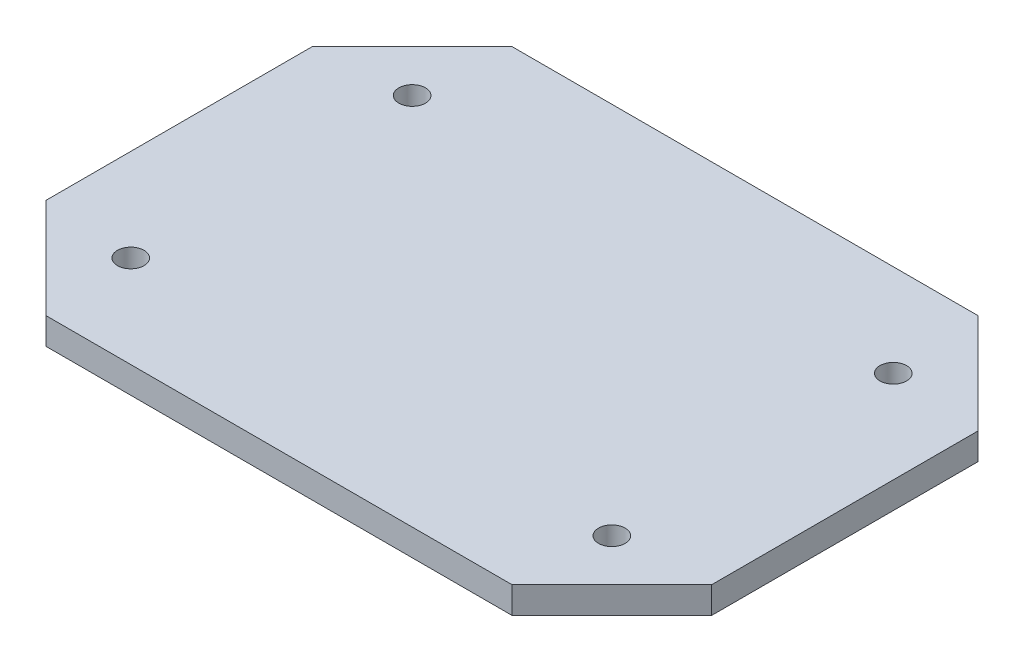
ISO-10303-21;
HEADER;
FILE_DESCRIPTION(('STEP AP214'),'2;1');
FILE_NAME('part.step','',(''),(''),'','','');
FILE_SCHEMA(('AUTOMOTIVE_DESIGN { 1 0 10303 214 1 1 1 1 }'));
ENDSEC;
DATA;
#1=APPLICATION_CONTEXT('core data for automotive mechanical design processes');
#2=APPLICATION_PROTOCOL_DEFINITION('international standard','automotive_design',2000,#1);
#3=PRODUCT_CONTEXT('',#1,'mechanical');
#4=PRODUCT('Part','Part','',(#3));
#5=PRODUCT_RELATED_PRODUCT_CATEGORY('part','',(#4));
#6=PRODUCT_DEFINITION_FORMATION('','',#4);
#7=PRODUCT_DEFINITION_CONTEXT('part definition',#1,'design');
#8=PRODUCT_DEFINITION('design','',#6,#7);
#9=PRODUCT_DEFINITION_SHAPE('','',#8);
#10=(LENGTH_UNIT() NAMED_UNIT(*) SI_UNIT(.MILLI.,.METRE.));
#11=(NAMED_UNIT(*) PLANE_ANGLE_UNIT() SI_UNIT($,.RADIAN.));
#12=(NAMED_UNIT(*) SI_UNIT($,.STERADIAN.) SOLID_ANGLE_UNIT());
#13=UNCERTAINTY_MEASURE_WITH_UNIT(LENGTH_MEASURE(1.E-05),#10,'distance_accuracy_value','');
#14=(GEOMETRIC_REPRESENTATION_CONTEXT(3) GLOBAL_UNCERTAINTY_ASSIGNED_CONTEXT((#13)) GLOBAL_UNIT_ASSIGNED_CONTEXT((#10,
#11,#12)) REPRESENTATION_CONTEXT('',''));
#15=CARTESIAN_POINT('',(0.,0.,0.));
#16=DIRECTION('',(0.,0.,1.));
#17=DIRECTION('',(1.,0.,0.));
#18=AXIS2_PLACEMENT_3D('',#15,#16,#17);
#19=CARTESIAN_POINT('',(0.,5.08,0.));
#20=DIRECTION('',(0.,-1.,0.));
#21=DIRECTION('',(0.,0.,-1.));
#22=AXIS2_PLACEMENT_3D('',#19,#20,#21);
#23=PLANE('',#22);
#24=DIRECTION('',(-0.707106781186546,0.,0.707106781186549));
#25=VECTOR('',#24,1.);
#26=CARTESIAN_POINT('',(19.05,5.08,-88.9));
#27=LINE('',#26,#25);
#28=CARTESIAN_POINT('',(19.05,5.08,-88.9));
#29=VERTEX_POINT('',#28);
#30=CARTESIAN_POINT('',(0.,5.08,-69.8499999999999));
#31=VERTEX_POINT('',#30);
#32=EDGE_CURVE('E149',#29,#31,#27,.T.);
#33=ORIENTED_EDGE('',*,*,#32,.T.);
#34=DIRECTION('',(0.,0.,1.));
#35=VECTOR('',#34,1.);
#36=CARTESIAN_POINT('',(0.,5.08,-69.8499999999999));
#37=LINE('',#36,#35);
#38=CARTESIAN_POINT('',(0.,5.08,-19.05));
#39=VERTEX_POINT('',#38);
#40=EDGE_CURVE('E97',#31,#39,#37,.T.);
#41=ORIENTED_EDGE('',*,*,#40,.T.);
#42=DIRECTION('',(0.707106781186547,0.,0.707106781186548));
#43=VECTOR('',#42,1.);
#44=CARTESIAN_POINT('',(19.05,5.08,0.));
#45=LINE('',#44,#43);
#46=CARTESIAN_POINT('',(19.05,5.08,0.));
#47=VERTEX_POINT('',#46);
#48=EDGE_CURVE('E164',#39,#47,#45,.T.);
#49=ORIENTED_EDGE('',*,*,#48,.T.);
#50=DIRECTION('',(1.,0.,0.));
#51=VECTOR('',#50,1.);
#52=CARTESIAN_POINT('',(107.95,5.08,0.));
#53=LINE('',#52,#51);
#54=CARTESIAN_POINT('',(107.95,5.08,0.));
#55=VERTEX_POINT('',#54);
#56=EDGE_CURVE('E177',#47,#55,#53,.T.);
#57=ORIENTED_EDGE('',*,*,#56,.T.);
#58=DIRECTION('',(0.707106781186546,0.,-0.707106781186549));
#59=VECTOR('',#58,1.);
#60=CARTESIAN_POINT('',(107.95,5.08,0.));
#61=LINE('',#60,#59);
#62=CARTESIAN_POINT('',(127.,5.08,-19.0500000000001));
#63=VERTEX_POINT('',#62);
#64=EDGE_CURVE('E116',#55,#63,#61,.T.);
#65=ORIENTED_EDGE('',*,*,#64,.T.);
#66=DIRECTION('',(0.,0.,-1.));
#67=VECTOR('',#66,1.);
#68=CARTESIAN_POINT('',(127.,5.08,-69.8499999999999));
#69=LINE('',#68,#67);
#70=CARTESIAN_POINT('',(127.,5.08,-69.8499999999999));
#71=VERTEX_POINT('',#70);
#72=EDGE_CURVE('E110',#63,#71,#69,.T.);
#73=ORIENTED_EDGE('',*,*,#72,.T.);
#74=DIRECTION('',(-0.707106781186547,0.,-0.707106781186549));
#75=VECTOR('',#74,1.);
#76=CARTESIAN_POINT('',(107.95,5.08,-88.9));
#77=LINE('',#76,#75);
#78=CARTESIAN_POINT('',(107.95,5.08,-88.9));
#79=VERTEX_POINT('',#78);
#80=EDGE_CURVE('E114',#71,#79,#77,.T.);
#81=ORIENTED_EDGE('',*,*,#80,.T.);
#82=DIRECTION('',(-1.,0.,0.));
#83=VECTOR('',#82,1.);
#84=CARTESIAN_POINT('',(107.95,5.08,-88.9));
#85=LINE('',#84,#83);
#86=EDGE_CURVE('E54',#79,#29,#85,.T.);
#87=ORIENTED_EDGE('',*,*,#86,.T.);
#88=EDGE_LOOP('',(#33,#41,#49,#57,#65,#73,#81,#87));
#89=FACE_BOUND('',#88,.T.);
#90=CARTESIAN_POINT('',(17.6072305089622,5.08,-71.2927694910377));
#91=DIRECTION('',(0.,1.,0.));
#92=DIRECTION('',(0.,0.,1.));
#93=AXIS2_PLACEMENT_3D('',#90,#91,#92);
#94=CIRCLE('',#93,2.54);
#95=CARTESIAN_POINT('',(17.6072305089622,5.08,-68.7527694910377));
#96=VERTEX_POINT('',#95);
#97=EDGE_CURVE('E138',#96,#96,#94,.T.);
#98=ORIENTED_EDGE('',*,*,#97,.F.);
#99=EDGE_LOOP('',(#98));
#100=FACE_BOUND('',#99,.T.);
#101=CARTESIAN_POINT('',(17.6072305089622,5.08,-17.6072305089623));
#102=DIRECTION('',(0.,1.,0.));
#103=DIRECTION('',(0.,0.,-1.));
#104=AXIS2_PLACEMENT_3D('',#101,#102,#103);
#105=CIRCLE('',#104,2.54);
#106=CARTESIAN_POINT('',(17.6072305089622,5.08,-20.1472305089623));
#107=VERTEX_POINT('',#106);
#108=EDGE_CURVE('E186',#107,#107,#105,.T.);
#109=ORIENTED_EDGE('',*,*,#108,.F.);
#110=EDGE_LOOP('',(#109));
#111=FACE_BOUND('',#110,.T.);
#112=CARTESIAN_POINT('',(109.392769491038,5.08,-17.6072305089623));
#113=DIRECTION('',(0.,1.,0.));
#114=DIRECTION('',(0.,0.,1.));
#115=AXIS2_PLACEMENT_3D('',#112,#113,#114);
#116=CIRCLE('',#115,2.54);
#117=CARTESIAN_POINT('',(109.392769491038,5.08,-15.0672305089623));
#118=VERTEX_POINT('',#117);
#119=EDGE_CURVE('E192',#118,#118,#116,.T.);
#120=ORIENTED_EDGE('',*,*,#119,.F.);
#121=EDGE_LOOP('',(#120));
#122=FACE_BOUND('',#121,.T.);
#123=CARTESIAN_POINT('',(109.392769491038,5.08,-71.2927694910377));
#124=DIRECTION('',(0.,1.,0.));
#125=DIRECTION('',(0.,0.,-1.));
#126=AXIS2_PLACEMENT_3D('',#123,#124,#125);
#127=CIRCLE('',#126,2.53999999999999);
#128=CARTESIAN_POINT('',(109.392769491038,5.08,-73.8327694910377));
#129=VERTEX_POINT('',#128);
#130=EDGE_CURVE('E198',#129,#129,#127,.T.);
#131=ORIENTED_EDGE('',*,*,#130,.F.);
#132=EDGE_LOOP('',(#131));
#133=FACE_BOUND('',#132,.T.);
#134=ADVANCED_FACE('F37',(#89,#100,#111,#122,#133),#23,.F.);
#135=CARTESIAN_POINT('',(0.,0.,0.));
#136=DIRECTION('',(0.,-1.,0.));
#137=DIRECTION('',(0.,0.,-1.));
#138=AXIS2_PLACEMENT_3D('',#135,#136,#137);
#139=PLANE('',#138);
#140=CARTESIAN_POINT('',(109.392769491038,0.,-17.6072305089623));
#141=DIRECTION('',(0.,1.,0.));
#142=DIRECTION('',(0.,0.,1.));
#143=AXIS2_PLACEMENT_3D('',#140,#141,#142);
#144=CIRCLE('',#143,2.54);
#145=CARTESIAN_POINT('',(109.392769491038,0.,-15.0672305089623));
#146=VERTEX_POINT('',#145);
#147=EDGE_CURVE('E195',#146,#146,#144,.T.);
#148=ORIENTED_EDGE('',*,*,#147,.T.);
#149=EDGE_LOOP('',(#148));
#150=FACE_BOUND('',#149,.T.);
#151=CARTESIAN_POINT('',(17.6072305089622,0.,-71.2927694910377));
#152=DIRECTION('',(0.,1.,0.));
#153=DIRECTION('',(0.,0.,1.));
#154=AXIS2_PLACEMENT_3D('',#151,#152,#153);
#155=CIRCLE('',#154,2.54);
#156=CARTESIAN_POINT('',(17.6072305089622,0.,-68.7527694910377));
#157=VERTEX_POINT('',#156);
#158=EDGE_CURVE('E183',#157,#157,#155,.T.);
#159=ORIENTED_EDGE('',*,*,#158,.T.);
#160=EDGE_LOOP('',(#159));
#161=FACE_BOUND('',#160,.T.);
#162=DIRECTION('',(-0.707106781186546,0.,0.707106781186549));
#163=VECTOR('',#162,1.);
#164=CARTESIAN_POINT('',(19.05,0.,-88.9));
#165=LINE('',#164,#163);
#166=CARTESIAN_POINT('',(19.05,0.,-88.9));
#167=VERTEX_POINT('',#166);
#168=CARTESIAN_POINT('',(0.,0.,-69.8499999999999));
#169=VERTEX_POINT('',#168);
#170=EDGE_CURVE('E134',#167,#169,#165,.T.);
#171=ORIENTED_EDGE('',*,*,#170,.F.);
#172=DIRECTION('',(-1.,0.,0.));
#173=VECTOR('',#172,1.);
#174=CARTESIAN_POINT('',(107.95,0.,-88.9));
#175=LINE('',#174,#173);
#176=CARTESIAN_POINT('',(107.95,0.,-88.9));
#177=VERTEX_POINT('',#176);
#178=EDGE_CURVE('E89',#177,#167,#175,.T.);
#179=ORIENTED_EDGE('',*,*,#178,.F.);
#180=DIRECTION('',(-0.707106781186547,0.,-0.707106781186549));
#181=VECTOR('',#180,1.);
#182=CARTESIAN_POINT('',(107.95,0.,-88.9));
#183=LINE('',#182,#181);
#184=CARTESIAN_POINT('',(127.,0.,-69.8499999999999));
#185=VERTEX_POINT('',#184);
#186=EDGE_CURVE('E83',#185,#177,#183,.T.);
#187=ORIENTED_EDGE('',*,*,#186,.F.);
#188=DIRECTION('',(0.,0.,-1.));
#189=VECTOR('',#188,1.);
#190=CARTESIAN_POINT('',(127.,0.,-69.8499999999999));
#191=LINE('',#190,#189);
#192=CARTESIAN_POINT('',(127.,0.,-19.0500000000001));
#193=VERTEX_POINT('',#192);
#194=EDGE_CURVE('E124',#193,#185,#191,.T.);
#195=ORIENTED_EDGE('',*,*,#194,.F.);
#196=DIRECTION('',(0.707106781186546,0.,-0.707106781186549));
#197=VECTOR('',#196,1.);
#198=CARTESIAN_POINT('',(107.95,0.,0.));
#199=LINE('',#198,#197);
#200=CARTESIAN_POINT('',(107.95,0.,0.));
#201=VERTEX_POINT('',#200);
#202=EDGE_CURVE('E144',#201,#193,#199,.T.);
#203=ORIENTED_EDGE('',*,*,#202,.F.);
#204=DIRECTION('',(1.,0.,0.));
#205=VECTOR('',#204,1.);
#206=CARTESIAN_POINT('',(107.95,0.,0.));
#207=LINE('',#206,#205);
#208=CARTESIAN_POINT('',(19.05,0.,0.));
#209=VERTEX_POINT('',#208);
#210=EDGE_CURVE('E142',#209,#201,#207,.T.);
#211=ORIENTED_EDGE('',*,*,#210,.F.);
#212=DIRECTION('',(0.707106781186547,0.,0.707106781186548));
#213=VECTOR('',#212,1.);
#214=CARTESIAN_POINT('',(19.05,0.,0.));
#215=LINE('',#214,#213);
#216=CARTESIAN_POINT('',(0.,0.,-19.05));
#217=VERTEX_POINT('',#216);
#218=EDGE_CURVE('E140',#217,#209,#215,.T.);
#219=ORIENTED_EDGE('',*,*,#218,.F.);
#220=DIRECTION('',(0.,0.,1.));
#221=VECTOR('',#220,1.);
#222=CARTESIAN_POINT('',(0.,0.,-69.8499999999999));
#223=LINE('',#222,#221);
#224=EDGE_CURVE('E137',#169,#217,#223,.T.);
#225=ORIENTED_EDGE('',*,*,#224,.F.);
#226=EDGE_LOOP('',(#171,#179,#187,#195,#203,#211,#219,#225));
#227=FACE_BOUND('',#226,.T.);
#228=CARTESIAN_POINT('',(17.6072305089622,0.,-17.6072305089623));
#229=DIRECTION('',(0.,1.,0.));
#230=DIRECTION('',(0.,0.,-1.));
#231=AXIS2_PLACEMENT_3D('',#228,#229,#230);
#232=CIRCLE('',#231,2.54);
#233=CARTESIAN_POINT('',(17.6072305089622,0.,-20.1472305089623));
#234=VERTEX_POINT('',#233);
#235=EDGE_CURVE('E189',#234,#234,#232,.T.);
#236=ORIENTED_EDGE('',*,*,#235,.T.);
#237=EDGE_LOOP('',(#236));
#238=FACE_BOUND('',#237,.T.);
#239=CARTESIAN_POINT('',(109.392769491038,0.,-71.2927694910377));
#240=DIRECTION('',(0.,1.,0.));
#241=DIRECTION('',(0.,0.,-1.));
#242=AXIS2_PLACEMENT_3D('',#239,#240,#241);
#243=CIRCLE('',#242,2.53999999999999);
#244=CARTESIAN_POINT('',(109.392769491038,0.,-73.8327694910377));
#245=VERTEX_POINT('',#244);
#246=EDGE_CURVE('E201',#245,#245,#243,.T.);
#247=ORIENTED_EDGE('',*,*,#246,.T.);
#248=EDGE_LOOP('',(#247));
#249=FACE_BOUND('',#248,.T.);
#250=ADVANCED_FACE('F168',(#150,#161,#227,#238,#249),#139,.T.);
#251=CARTESIAN_POINT('',(19.05,5.08,-88.9));
#252=DIRECTION('',(0.707106781186549,0.,0.707106781186546));
#253=DIRECTION('',(0.707106781186546,0.,-0.707106781186549));
#254=AXIS2_PLACEMENT_3D('',#251,#252,#253);
#255=PLANE('',#254);
#256=ORIENTED_EDGE('',*,*,#170,.T.);
#257=DIRECTION('',(0.,-1.,0.));
#258=VECTOR('',#257,1.);
#259=CARTESIAN_POINT('',(0.,5.08,-69.8499999999999));
#260=LINE('',#259,#258);
#261=EDGE_CURVE('E11',#31,#169,#260,.T.);
#262=ORIENTED_EDGE('',*,*,#261,.F.);
#263=ORIENTED_EDGE('',*,*,#32,.F.);
#264=DIRECTION('',(0.,-1.,0.));
#265=VECTOR('',#264,1.);
#266=CARTESIAN_POINT('',(19.05,5.08,-88.9));
#267=LINE('',#266,#265);
#268=EDGE_CURVE('E130',#29,#167,#267,.T.);
#269=ORIENTED_EDGE('',*,*,#268,.T.);
#270=EDGE_LOOP('',(#256,#262,#263,#269));
#271=FACE_BOUND('',#270,.T.);
#272=ADVANCED_FACE('F39',(#271),#255,.F.);
#273=CARTESIAN_POINT('',(0.,5.08,-69.8499999999999));
#274=DIRECTION('',(1.,0.,0.));
#275=DIRECTION('',(0.,0.,-1.));
#276=AXIS2_PLACEMENT_3D('',#273,#274,#275);
#277=PLANE('',#276);
#278=ORIENTED_EDGE('',*,*,#224,.T.);
#279=DIRECTION('',(0.,-1.,0.));
#280=VECTOR('',#279,1.);
#281=CARTESIAN_POINT('',(0.,5.08,-19.05));
#282=LINE('',#281,#280);
#283=EDGE_CURVE('E46',#39,#217,#282,.T.);
#284=ORIENTED_EDGE('',*,*,#283,.F.);
#285=ORIENTED_EDGE('',*,*,#40,.F.);
#286=ORIENTED_EDGE('',*,*,#261,.T.);
#287=EDGE_LOOP('',(#278,#284,#285,#286));
#288=FACE_BOUND('',#287,.T.);
#289=ADVANCED_FACE('F233',(#288),#277,.F.);
#290=CARTESIAN_POINT('',(19.05,5.08,0.));
#291=DIRECTION('',(0.707106781186548,0.,-0.707106781186547));
#292=DIRECTION('',(-0.707106781186547,0.,-0.707106781186548));
#293=AXIS2_PLACEMENT_3D('',#290,#291,#292);
#294=PLANE('',#293);
#295=ORIENTED_EDGE('',*,*,#218,.T.);
#296=DIRECTION('',(0.,-1.,0.));
#297=VECTOR('',#296,1.);
#298=CARTESIAN_POINT('',(19.05,5.08,0.));
#299=LINE('',#298,#297);
#300=EDGE_CURVE('E156',#47,#209,#299,.T.);
#301=ORIENTED_EDGE('',*,*,#300,.F.);
#302=ORIENTED_EDGE('',*,*,#48,.F.);
#303=ORIENTED_EDGE('',*,*,#283,.T.);
#304=EDGE_LOOP('',(#295,#301,#302,#303));
#305=FACE_BOUND('',#304,.T.);
#306=ADVANCED_FACE('F162',(#305),#294,.F.);
#307=CARTESIAN_POINT('',(107.95,5.08,0.));
#308=DIRECTION('',(0.,0.,-1.));
#309=DIRECTION('',(-1.,0.,0.));
#310=AXIS2_PLACEMENT_3D('',#307,#308,#309);
#311=PLANE('',#310);
#312=ORIENTED_EDGE('',*,*,#210,.T.);
#313=DIRECTION('',(0.,-1.,0.));
#314=VECTOR('',#313,1.);
#315=CARTESIAN_POINT('',(107.95,5.08,0.));
#316=LINE('',#315,#314);
#317=EDGE_CURVE('E153',#55,#201,#316,.T.);
#318=ORIENTED_EDGE('',*,*,#317,.F.);
#319=ORIENTED_EDGE('',*,*,#56,.F.);
#320=ORIENTED_EDGE('',*,*,#300,.T.);
#321=EDGE_LOOP('',(#312,#318,#319,#320));
#322=FACE_BOUND('',#321,.T.);
#323=ADVANCED_FACE('F173',(#322),#311,.F.);
#324=CARTESIAN_POINT('',(107.95,5.08,0.));
#325=DIRECTION('',(-0.707106781186549,0.,-0.707106781186546));
#326=DIRECTION('',(-0.707106781186546,0.,0.707106781186549));
#327=AXIS2_PLACEMENT_3D('',#324,#325,#326);
#328=PLANE('',#327);
#329=ORIENTED_EDGE('',*,*,#202,.T.);
#330=DIRECTION('',(0.,-1.,0.));
#331=VECTOR('',#330,1.);
#332=CARTESIAN_POINT('',(127.,5.08,-19.0500000000001));
#333=LINE('',#332,#331);
#334=EDGE_CURVE('E125',#63,#193,#333,.T.);
#335=ORIENTED_EDGE('',*,*,#334,.F.);
#336=ORIENTED_EDGE('',*,*,#64,.F.);
#337=ORIENTED_EDGE('',*,*,#317,.T.);
#338=EDGE_LOOP('',(#329,#335,#336,#337));
#339=FACE_BOUND('',#338,.T.);
#340=ADVANCED_FACE('F176',(#339),#328,.F.);
#341=CARTESIAN_POINT('',(127.,5.08,-69.8499999999999));
#342=DIRECTION('',(-1.,0.,0.));
#343=DIRECTION('',(0.,0.,1.));
#344=AXIS2_PLACEMENT_3D('',#341,#342,#343);
#345=PLANE('',#344);
#346=ORIENTED_EDGE('',*,*,#194,.T.);
#347=DIRECTION('',(0.,-1.,0.));
#348=VECTOR('',#347,1.);
#349=CARTESIAN_POINT('',(127.,5.08,-69.8499999999999));
#350=LINE('',#349,#348);
#351=EDGE_CURVE('E121',#71,#185,#350,.T.);
#352=ORIENTED_EDGE('',*,*,#351,.F.);
#353=ORIENTED_EDGE('',*,*,#72,.F.);
#354=ORIENTED_EDGE('',*,*,#334,.T.);
#355=EDGE_LOOP('',(#346,#352,#353,#354));
#356=FACE_BOUND('',#355,.T.);
#357=ADVANCED_FACE('F122',(#356),#345,.F.);
#358=CARTESIAN_POINT('',(107.95,5.08,-88.9));
#359=DIRECTION('',(-0.707106781186549,0.,0.707106781186546));
#360=DIRECTION('',(0.707106781186546,0.,0.707106781186549));
#361=AXIS2_PLACEMENT_3D('',#358,#359,#360);
#362=PLANE('',#361);
#363=ORIENTED_EDGE('',*,*,#186,.T.);
#364=DIRECTION('',(0.,-1.,0.));
#365=VECTOR('',#364,1.);
#366=CARTESIAN_POINT('',(107.95,5.08,-88.9));
#367=LINE('',#366,#365);
#368=EDGE_CURVE('E126',#79,#177,#367,.T.);
#369=ORIENTED_EDGE('',*,*,#368,.F.);
#370=ORIENTED_EDGE('',*,*,#80,.F.);
#371=ORIENTED_EDGE('',*,*,#351,.T.);
#372=EDGE_LOOP('',(#363,#369,#370,#371));
#373=FACE_BOUND('',#372,.T.);
#374=ADVANCED_FACE('F128',(#373),#362,.F.);
#375=CARTESIAN_POINT('',(107.95,5.08,-88.9));
#376=DIRECTION('',(0.,0.,1.));
#377=DIRECTION('',(1.,0.,0.));
#378=AXIS2_PLACEMENT_3D('',#375,#376,#377);
#379=PLANE('',#378);
#380=ORIENTED_EDGE('',*,*,#178,.T.);
#381=ORIENTED_EDGE('',*,*,#268,.F.);
#382=ORIENTED_EDGE('',*,*,#86,.F.);
#383=ORIENTED_EDGE('',*,*,#368,.T.);
#384=EDGE_LOOP('',(#380,#381,#382,#383));
#385=FACE_BOUND('',#384,.T.);
#386=ADVANCED_FACE('F221',(#385),#379,.F.);
#387=CARTESIAN_POINT('',(17.6072305089622,5.08,-71.2927694910377));
#388=DIRECTION('',(0.,-1.,0.));
#389=DIRECTION('',(0.,0.,-1.));
#390=AXIS2_PLACEMENT_3D('',#387,#388,#389);
#391=CYLINDRICAL_SURFACE('',#390,2.54);
#392=ORIENTED_EDGE('',*,*,#97,.T.);
#393=EDGE_LOOP('',(#392));
#394=FACE_BOUND('',#393,.T.);
#395=ORIENTED_EDGE('',*,*,#158,.F.);
#396=EDGE_LOOP('',(#395));
#397=FACE_BOUND('',#396,.T.);
#398=ADVANCED_FACE('F218',(#394,#397),#391,.F.);
#399=CARTESIAN_POINT('',(17.6072305089622,5.08,-17.6072305089623));
#400=DIRECTION('',(0.,-1.,0.));
#401=DIRECTION('',(0.,0.,-1.));
#402=AXIS2_PLACEMENT_3D('',#399,#400,#401);
#403=CYLINDRICAL_SURFACE('',#402,2.54);
#404=ORIENTED_EDGE('',*,*,#108,.T.);
#405=EDGE_LOOP('',(#404));
#406=FACE_BOUND('',#405,.T.);
#407=ORIENTED_EDGE('',*,*,#235,.F.);
#408=EDGE_LOOP('',(#407));
#409=FACE_BOUND('',#408,.T.);
#410=ADVANCED_FACE('F297',(#406,#409),#403,.F.);
#411=CARTESIAN_POINT('',(109.392769491038,5.08,-17.6072305089623));
#412=DIRECTION('',(0.,-1.,0.));
#413=DIRECTION('',(0.,0.,-1.));
#414=AXIS2_PLACEMENT_3D('',#411,#412,#413);
#415=CYLINDRICAL_SURFACE('',#414,2.54);
#416=ORIENTED_EDGE('',*,*,#119,.T.);
#417=EDGE_LOOP('',(#416));
#418=FACE_BOUND('',#417,.T.);
#419=ORIENTED_EDGE('',*,*,#147,.F.);
#420=EDGE_LOOP('',(#419));
#421=FACE_BOUND('',#420,.T.);
#422=ADVANCED_FACE('F305',(#418,#421),#415,.F.);
#423=CARTESIAN_POINT('',(109.392769491038,5.08,-71.2927694910377));
#424=DIRECTION('',(0.,-1.,0.));
#425=DIRECTION('',(0.,0.,-1.));
#426=AXIS2_PLACEMENT_3D('',#423,#424,#425);
#427=CYLINDRICAL_SURFACE('',#426,2.53999999999999);
#428=ORIENTED_EDGE('',*,*,#130,.T.);
#429=EDGE_LOOP('',(#428));
#430=FACE_BOUND('',#429,.T.);
#431=ORIENTED_EDGE('',*,*,#246,.F.);
#432=EDGE_LOOP('',(#431));
#433=FACE_BOUND('',#432,.T.);
#434=ADVANCED_FACE('F207',(#430,#433),#427,.F.);
#435=CLOSED_SHELL('',(#134,#250,#272,#289,#306,#323,#340,#357,#374,#386,#398,#410,#422,#434));
#436=MANIFOLD_SOLID_BREP('B2',#435);
#437=ADVANCED_BREP_SHAPE_REPRESENTATION('',(#18,#436),#14);
#438=SHAPE_DEFINITION_REPRESENTATION(#9,#437);
ENDSEC;
END-ISO-10303-21;
